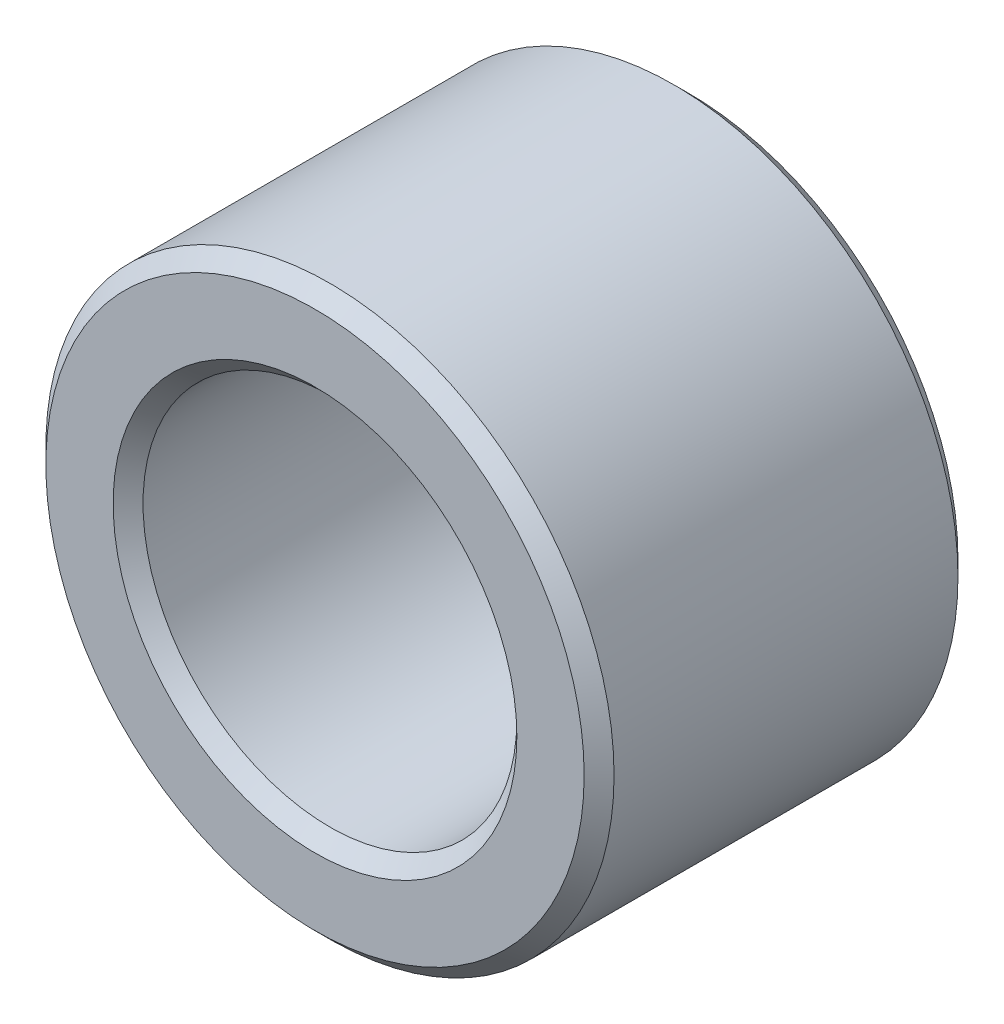
ISO-10303-21;
HEADER;
FILE_DESCRIPTION(('STEP AP214'),'2;1');
FILE_NAME('part.step','',(''),(''),'','','');
FILE_SCHEMA(('AUTOMOTIVE_DESIGN { 1 0 10303 214 1 1 1 1 }'));
ENDSEC;
DATA;
#1=APPLICATION_CONTEXT('core data for automotive mechanical design processes');
#2=APPLICATION_PROTOCOL_DEFINITION('international standard','automotive_design',2000,#1);
#3=PRODUCT_CONTEXT('',#1,'mechanical');
#4=PRODUCT('Part','Part','',(#3));
#5=PRODUCT_RELATED_PRODUCT_CATEGORY('part','',(#4));
#6=PRODUCT_DEFINITION_FORMATION('','',#4);
#7=PRODUCT_DEFINITION_CONTEXT('part definition',#1,'design');
#8=PRODUCT_DEFINITION('design','',#6,#7);
#9=PRODUCT_DEFINITION_SHAPE('','',#8);
#10=(LENGTH_UNIT() NAMED_UNIT(*) SI_UNIT(.MILLI.,.METRE.));
#11=(NAMED_UNIT(*) PLANE_ANGLE_UNIT() SI_UNIT($,.RADIAN.));
#12=(NAMED_UNIT(*) SI_UNIT($,.STERADIAN.) SOLID_ANGLE_UNIT());
#13=UNCERTAINTY_MEASURE_WITH_UNIT(LENGTH_MEASURE(1.E-05),#10,'distance_accuracy_value','');
#14=(GEOMETRIC_REPRESENTATION_CONTEXT(3) GLOBAL_UNCERTAINTY_ASSIGNED_CONTEXT((#13)) GLOBAL_UNIT_ASSIGNED_CONTEXT((#10,
#11,#12)) REPRESENTATION_CONTEXT('',''));
#15=CARTESIAN_POINT('',(0.,0.,0.));
#16=DIRECTION('',(0.,0.,1.));
#17=DIRECTION('',(1.,0.,0.));
#18=AXIS2_PLACEMENT_3D('',#15,#16,#17);
#19=CARTESIAN_POINT('',(0.,0.,6.35));
#20=DIRECTION('',(0.,0.,1.));
#21=DIRECTION('',(1.,0.,0.));
#22=AXIS2_PLACEMENT_3D('',#19,#20,#21);
#23=PLANE('',#22);
#24=CARTESIAN_POINT('',(0.,0.,6.35));
#25=DIRECTION('',(0.,0.,1.));
#26=DIRECTION('',(1.,0.,0.));
#27=AXIS2_PLACEMENT_3D('',#24,#25,#26);
#28=CIRCLE('',#27,4.572);
#29=CARTESIAN_POINT('',(4.572,0.,6.35));
#30=VERTEX_POINT('',#29);
#31=EDGE_CURVE('E10',#30,#30,#28,.T.);
#32=ORIENTED_EDGE('',*,*,#31,.T.);
#33=EDGE_LOOP('',(#32));
#34=FACE_BOUND('',#33,.T.);
#35=CARTESIAN_POINT('',(0.,0.,6.35));
#36=DIRECTION('',(0.,0.,1.));
#37=DIRECTION('',(1.,0.,0.));
#38=AXIS2_PLACEMENT_3D('',#35,#36,#37);
#39=CIRCLE('',#38,3.429);
#40=CARTESIAN_POINT('',(3.429,0.,6.35));
#41=VERTEX_POINT('',#40);
#42=EDGE_CURVE('E54',#41,#41,#39,.F.);
#43=ORIENTED_EDGE('',*,*,#42,.T.);
#44=EDGE_LOOP('',(#43));
#45=FACE_BOUND('',#44,.T.);
#46=ADVANCED_FACE('F45',(#34,#45),#23,.T.);
#47=CARTESIAN_POINT('',(0.,0.,0.));
#48=DIRECTION('',(0.,0.,1.));
#49=DIRECTION('',(1.,0.,0.));
#50=AXIS2_PLACEMENT_3D('',#47,#48,#49);
#51=PLANE('',#50);
#52=CARTESIAN_POINT('',(0.,0.,0.));
#53=DIRECTION('',(0.,0.,1.));
#54=DIRECTION('',(1.,0.,0.));
#55=AXIS2_PLACEMENT_3D('',#52,#53,#54);
#56=CIRCLE('',#55,4.572);
#57=CARTESIAN_POINT('',(4.572,0.,0.));
#58=VERTEX_POINT('',#57);
#59=EDGE_CURVE('E70',#58,#58,#56,.F.);
#60=ORIENTED_EDGE('',*,*,#59,.T.);
#61=EDGE_LOOP('',(#60));
#62=FACE_BOUND('',#61,.T.);
#63=CARTESIAN_POINT('',(0.,0.,0.));
#64=DIRECTION('',(0.,0.,1.));
#65=DIRECTION('',(1.,0.,0.));
#66=AXIS2_PLACEMENT_3D('',#63,#64,#65);
#67=CIRCLE('',#66,3.429);
#68=CARTESIAN_POINT('',(3.429,0.,0.));
#69=VERTEX_POINT('',#68);
#70=EDGE_CURVE('E74',#69,#69,#67,.T.);
#71=ORIENTED_EDGE('',*,*,#70,.T.);
#72=EDGE_LOOP('',(#71));
#73=FACE_BOUND('',#72,.T.);
#74=ADVANCED_FACE('F103',(#62,#73),#51,.F.);
#75=CARTESIAN_POINT('',(0.,0.,6.35));
#76=DIRECTION('',(0.,0.,-1.));
#77=DIRECTION('',(-1.,0.,0.));
#78=AXIS2_PLACEMENT_3D('',#75,#76,#77);
#79=CYLINDRICAL_SURFACE('',#78,4.826);
#80=CARTESIAN_POINT('',(0.,0.,0.254000000000003));
#81=DIRECTION('',(0.,0.,1.));
#82=DIRECTION('',(1.,0.,0.));
#83=AXIS2_PLACEMENT_3D('',#80,#81,#82);
#84=CIRCLE('',#83,4.826);
#85=CARTESIAN_POINT('',(4.826,0.,0.254000000000003));
#86=VERTEX_POINT('',#85);
#87=EDGE_CURVE('E78',#86,#86,#84,.T.);
#88=ORIENTED_EDGE('',*,*,#87,.T.);
#89=EDGE_LOOP('',(#88));
#90=FACE_BOUND('',#89,.T.);
#91=CARTESIAN_POINT('',(0.,0.,6.096));
#92=DIRECTION('',(0.,0.,1.));
#93=DIRECTION('',(1.,0.,0.));
#94=AXIS2_PLACEMENT_3D('',#91,#92,#93);
#95=CIRCLE('',#94,4.826);
#96=CARTESIAN_POINT('',(4.826,0.,6.096));
#97=VERTEX_POINT('',#96);
#98=EDGE_CURVE('E82',#97,#97,#95,.F.);
#99=ORIENTED_EDGE('',*,*,#98,.T.);
#100=EDGE_LOOP('',(#99));
#101=FACE_BOUND('',#100,.T.);
#102=ADVANCED_FACE('F87',(#90,#101),#79,.T.);
#103=CARTESIAN_POINT('',(0.,0.,6.35));
#104=DIRECTION('',(0.,0.,-1.));
#105=DIRECTION('',(-1.,0.,0.));
#106=AXIS2_PLACEMENT_3D('',#103,#104,#105);
#107=CYLINDRICAL_SURFACE('',#106,3.175);
#108=CARTESIAN_POINT('',(0.,0.,0.254000000000003));
#109=DIRECTION('',(0.,0.,1.));
#110=DIRECTION('',(1.,0.,0.));
#111=AXIS2_PLACEMENT_3D('',#108,#109,#110);
#112=CIRCLE('',#111,3.175);
#113=CARTESIAN_POINT('',(3.175,0.,0.254000000000003));
#114=VERTEX_POINT('',#113);
#115=EDGE_CURVE('E59',#114,#114,#112,.F.);
#116=ORIENTED_EDGE('',*,*,#115,.T.);
#117=EDGE_LOOP('',(#116));
#118=FACE_BOUND('',#117,.T.);
#119=CARTESIAN_POINT('',(0.,0.,6.096));
#120=DIRECTION('',(0.,0.,1.));
#121=DIRECTION('',(1.,0.,0.));
#122=AXIS2_PLACEMENT_3D('',#119,#120,#121);
#123=CIRCLE('',#122,3.175);
#124=CARTESIAN_POINT('',(3.175,0.,6.096));
#125=VERTEX_POINT('',#124);
#126=EDGE_CURVE('E64',#125,#125,#123,.T.);
#127=ORIENTED_EDGE('',*,*,#126,.T.);
#128=EDGE_LOOP('',(#127));
#129=FACE_BOUND('',#128,.T.);
#130=ADVANCED_FACE('F111',(#118,#129),#107,.F.);
#131=CARTESIAN_POINT('',(0.,0.,0.254000000000003));
#132=DIRECTION('',(0.,0.,1.));
#133=DIRECTION('',(1.,0.,0.));
#134=AXIS2_PLACEMENT_3D('',#131,#132,#133);
#135=CONICAL_SURFACE('',#134,4.826,0.78539816339745);
#136=ORIENTED_EDGE('',*,*,#59,.F.);
#137=EDGE_LOOP('',(#136));
#138=FACE_BOUND('',#137,.T.);
#139=ORIENTED_EDGE('',*,*,#87,.F.);
#140=EDGE_LOOP('',(#139));
#141=FACE_BOUND('',#140,.T.);
#142=ADVANCED_FACE('F98',(#138,#141),#135,.T.);
#143=CARTESIAN_POINT('',(0.,0.,0.));
#144=DIRECTION('',(0.,0.,-1.));
#145=DIRECTION('',(-1.,0.,0.));
#146=AXIS2_PLACEMENT_3D('',#143,#144,#145);
#147=CONICAL_SURFACE('',#146,3.429,0.785398163397445);
#148=ORIENTED_EDGE('',*,*,#115,.F.);
#149=EDGE_LOOP('',(#148));
#150=FACE_BOUND('',#149,.T.);
#151=ORIENTED_EDGE('',*,*,#70,.F.);
#152=EDGE_LOOP('',(#151));
#153=FACE_BOUND('',#152,.T.);
#154=ADVANCED_FACE('F92',(#150,#153),#147,.F.);
#155=CARTESIAN_POINT('',(0.,0.,6.35));
#156=DIRECTION('',(0.,0.,-1.));
#157=DIRECTION('',(-1.,0.,0.));
#158=AXIS2_PLACEMENT_3D('',#155,#156,#157);
#159=CONICAL_SURFACE('',#158,4.572,0.785398163397448);
#160=ORIENTED_EDGE('',*,*,#98,.F.);
#161=EDGE_LOOP('',(#160));
#162=FACE_BOUND('',#161,.T.);
#163=ORIENTED_EDGE('',*,*,#31,.F.);
#164=EDGE_LOOP('',(#163));
#165=FACE_BOUND('',#164,.T.);
#166=ADVANCED_FACE('F89',(#162,#165),#159,.T.);
#167=CARTESIAN_POINT('',(0.,0.,6.096));
#168=DIRECTION('',(0.,0.,1.));
#169=DIRECTION('',(1.,0.,0.));
#170=AXIS2_PLACEMENT_3D('',#167,#168,#169);
#171=CONICAL_SURFACE('',#170,3.175,0.785398163397451);
#172=ORIENTED_EDGE('',*,*,#42,.F.);
#173=EDGE_LOOP('',(#172));
#174=FACE_BOUND('',#173,.T.);
#175=ORIENTED_EDGE('',*,*,#126,.F.);
#176=EDGE_LOOP('',(#175));
#177=FACE_BOUND('',#176,.T.);
#178=ADVANCED_FACE('F48',(#174,#177),#171,.F.);
#179=CLOSED_SHELL('',(#46,#74,#102,#130,#142,#154,#166,#178));
#180=MANIFOLD_SOLID_BREP('B2',#179);
#181=ADVANCED_BREP_SHAPE_REPRESENTATION('',(#18,#180),#14);
#182=SHAPE_DEFINITION_REPRESENTATION(#9,#181);
ENDSEC;
END-ISO-10303-21;
